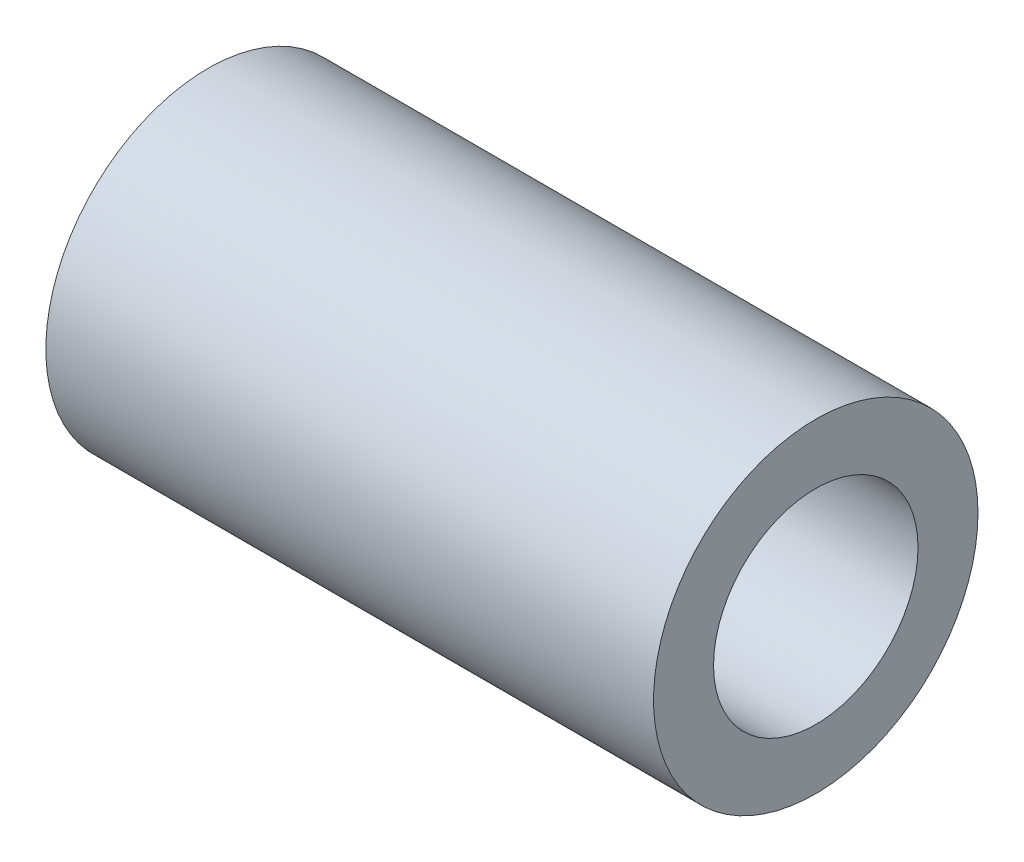
ISO-10303-21;
HEADER;
FILE_DESCRIPTION(('STEP AP214'),'2;1');
FILE_NAME('part.step','',(''),(''),'','','');
FILE_SCHEMA(('AUTOMOTIVE_DESIGN { 1 0 10303 214 1 1 1 1 }'));
ENDSEC;
DATA;
#1=APPLICATION_CONTEXT('core data for automotive mechanical design processes');
#2=APPLICATION_PROTOCOL_DEFINITION('international standard','automotive_design',2000,#1);
#3=PRODUCT_CONTEXT('',#1,'mechanical');
#4=PRODUCT('Part','Part','',(#3));
#5=PRODUCT_RELATED_PRODUCT_CATEGORY('part','',(#4));
#6=PRODUCT_DEFINITION_FORMATION('','',#4);
#7=PRODUCT_DEFINITION_CONTEXT('part definition',#1,'design');
#8=PRODUCT_DEFINITION('design','',#6,#7);
#9=PRODUCT_DEFINITION_SHAPE('','',#8);
#10=(LENGTH_UNIT() NAMED_UNIT(*) SI_UNIT(.MILLI.,.METRE.));
#11=(NAMED_UNIT(*) PLANE_ANGLE_UNIT() SI_UNIT($,.RADIAN.));
#12=(NAMED_UNIT(*) SI_UNIT($,.STERADIAN.) SOLID_ANGLE_UNIT());
#13=UNCERTAINTY_MEASURE_WITH_UNIT(LENGTH_MEASURE(1.E-05),#10,'distance_accuracy_value','');
#14=(GEOMETRIC_REPRESENTATION_CONTEXT(3) GLOBAL_UNCERTAINTY_ASSIGNED_CONTEXT((#13)) GLOBAL_UNIT_ASSIGNED_CONTEXT((#10,
#11,#12)) REPRESENTATION_CONTEXT('',''));
#15=CARTESIAN_POINT('',(0.,0.,0.));
#16=DIRECTION('',(0.,0.,1.));
#17=DIRECTION('',(1.,0.,0.));
#18=AXIS2_PLACEMENT_3D('',#15,#16,#17);
#19=CARTESIAN_POINT('',(28.3083,0.,0.));
#20=DIRECTION('',(1.,0.,0.));
#21=DIRECTION('',(0.,0.,-1.));
#22=AXIS2_PLACEMENT_3D('',#19,#20,#21);
#23=PLANE('',#22);
#24=CARTESIAN_POINT('',(28.3083,0.,0.));
#25=DIRECTION('',(1.,0.,0.));
#26=DIRECTION('',(0.,0.,-1.));
#27=AXIS2_PLACEMENT_3D('',#24,#25,#26);
#28=CIRCLE('',#27,15.113);
#29=CARTESIAN_POINT('',(28.3083,0.,-15.113));
#30=VERTEX_POINT('',#29);
#31=EDGE_CURVE('E9',#30,#30,#28,.T.);
#32=ORIENTED_EDGE('',*,*,#31,.T.);
#33=EDGE_LOOP('',(#32));
#34=FACE_BOUND('',#33,.T.);
#35=CARTESIAN_POINT('',(28.3083,0.,0.));
#36=DIRECTION('',(1.,0.,0.));
#37=DIRECTION('',(0.,0.,-1.));
#38=AXIS2_PLACEMENT_3D('',#35,#36,#37);
#39=CIRCLE('',#38,9.525);
#40=CARTESIAN_POINT('',(28.3083,0.,-9.525));
#41=VERTEX_POINT('',#40);
#42=EDGE_CURVE('E25',#41,#41,#39,.T.);
#43=ORIENTED_EDGE('',*,*,#42,.F.);
#44=EDGE_LOOP('',(#43));
#45=FACE_BOUND('',#44,.T.);
#46=ADVANCED_FACE('F14',(#34,#45),#23,.T.);
#47=CARTESIAN_POINT('',(-28.3083,0.,0.));
#48=DIRECTION('',(1.,0.,0.));
#49=DIRECTION('',(0.,0.,-1.));
#50=AXIS2_PLACEMENT_3D('',#47,#48,#49);
#51=PLANE('',#50);
#52=CARTESIAN_POINT('',(-28.3083,0.,0.));
#53=DIRECTION('',(1.,0.,0.));
#54=DIRECTION('',(0.,0.,-1.));
#55=AXIS2_PLACEMENT_3D('',#52,#53,#54);
#56=CIRCLE('',#55,15.113);
#57=CARTESIAN_POINT('',(-28.3083,0.,-15.113));
#58=VERTEX_POINT('',#57);
#59=EDGE_CURVE('E18',#58,#58,#56,.T.);
#60=ORIENTED_EDGE('',*,*,#59,.F.);
#61=EDGE_LOOP('',(#60));
#62=FACE_BOUND('',#61,.T.);
#63=CARTESIAN_POINT('',(-28.3083,0.,0.));
#64=DIRECTION('',(1.,0.,0.));
#65=DIRECTION('',(0.,0.,-1.));
#66=AXIS2_PLACEMENT_3D('',#63,#64,#65);
#67=CIRCLE('',#66,9.525);
#68=CARTESIAN_POINT('',(-28.3083,0.,-9.525));
#69=VERTEX_POINT('',#68);
#70=EDGE_CURVE('E27',#69,#69,#67,.T.);
#71=ORIENTED_EDGE('',*,*,#70,.T.);
#72=EDGE_LOOP('',(#71));
#73=FACE_BOUND('',#72,.T.);
#74=ADVANCED_FACE('F37',(#62,#73),#51,.F.);
#75=CARTESIAN_POINT('',(28.3083,0.,0.));
#76=DIRECTION('',(-1.,0.,0.));
#77=DIRECTION('',(0.,0.,1.));
#78=AXIS2_PLACEMENT_3D('',#75,#76,#77);
#79=CYLINDRICAL_SURFACE('',#78,15.113);
#80=ORIENTED_EDGE('',*,*,#31,.F.);
#81=EDGE_LOOP('',(#80));
#82=FACE_BOUND('',#81,.T.);
#83=ORIENTED_EDGE('',*,*,#59,.T.);
#84=EDGE_LOOP('',(#83));
#85=FACE_BOUND('',#84,.T.);
#86=ADVANCED_FACE('F16',(#82,#85),#79,.T.);
#87=CARTESIAN_POINT('',(28.3083,0.,0.));
#88=DIRECTION('',(-1.,0.,0.));
#89=DIRECTION('',(0.,0.,1.));
#90=AXIS2_PLACEMENT_3D('',#87,#88,#89);
#91=CYLINDRICAL_SURFACE('',#90,9.525);
#92=ORIENTED_EDGE('',*,*,#42,.T.);
#93=EDGE_LOOP('',(#92));
#94=FACE_BOUND('',#93,.T.);
#95=ORIENTED_EDGE('',*,*,#70,.F.);
#96=EDGE_LOOP('',(#95));
#97=FACE_BOUND('',#96,.T.);
#98=ADVANCED_FACE('F33',(#94,#97),#91,.F.);
#99=CLOSED_SHELL('',(#46,#74,#86,#98));
#100=MANIFOLD_SOLID_BREP('B1',#99);
#101=ADVANCED_BREP_SHAPE_REPRESENTATION('',(#18,#100),#14);
#102=SHAPE_DEFINITION_REPRESENTATION(#9,#101);
ENDSEC;
END-ISO-10303-21;
